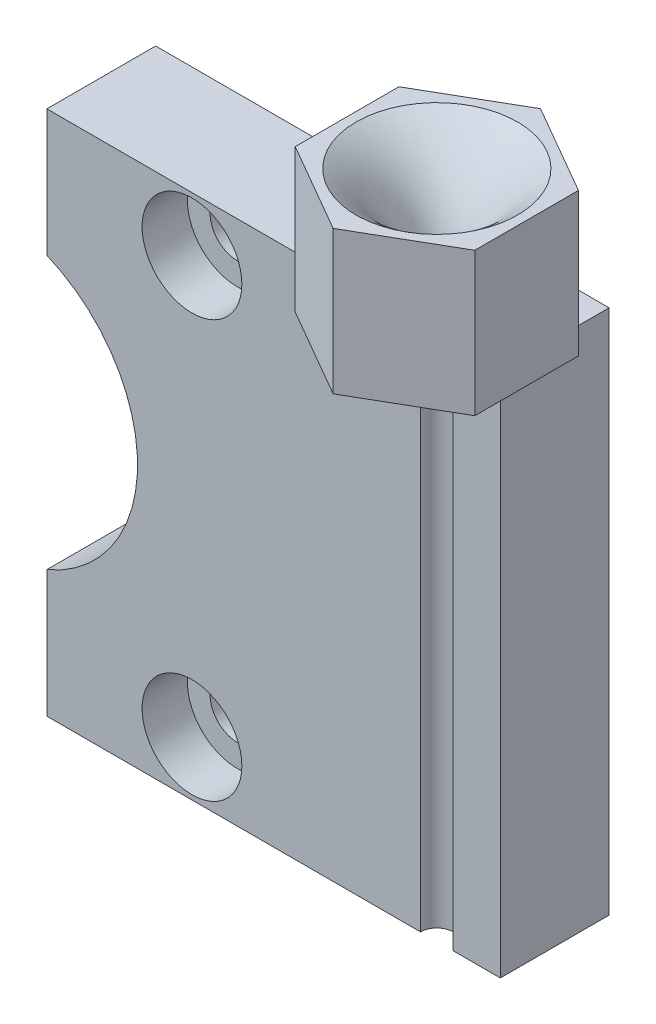
ISO-10303-21;
HEADER;
FILE_DESCRIPTION(('STEP AP214'),'2;1');
FILE_NAME('part.step','',(''),(''),'','','');
FILE_SCHEMA(('AUTOMOTIVE_DESIGN { 1 0 10303 214 1 1 1 1 }'));
ENDSEC;
DATA;
#1=APPLICATION_CONTEXT('core data for automotive mechanical design processes');
#2=APPLICATION_PROTOCOL_DEFINITION('international standard','automotive_design',2000,#1);
#3=PRODUCT_CONTEXT('',#1,'mechanical');
#4=PRODUCT('Part','Part','',(#3));
#5=PRODUCT_RELATED_PRODUCT_CATEGORY('part','',(#4));
#6=PRODUCT_DEFINITION_FORMATION('','',#4);
#7=PRODUCT_DEFINITION_CONTEXT('part definition',#1,'design');
#8=PRODUCT_DEFINITION('design','',#6,#7);
#9=PRODUCT_DEFINITION_SHAPE('','',#8);
#10=(LENGTH_UNIT() NAMED_UNIT(*) SI_UNIT(.MILLI.,.METRE.));
#11=(NAMED_UNIT(*) PLANE_ANGLE_UNIT() SI_UNIT($,.RADIAN.));
#12=(NAMED_UNIT(*) SI_UNIT($,.STERADIAN.) SOLID_ANGLE_UNIT());
#13=UNCERTAINTY_MEASURE_WITH_UNIT(LENGTH_MEASURE(1.E-05),#10,'distance_accuracy_value','');
#14=(GEOMETRIC_REPRESENTATION_CONTEXT(3) GLOBAL_UNCERTAINTY_ASSIGNED_CONTEXT((#13)) GLOBAL_UNIT_ASSIGNED_CONTEXT((#10,
#11,#12)) REPRESENTATION_CONTEXT('',''));
#15=CARTESIAN_POINT('',(0.,0.,0.));
#16=DIRECTION('',(0.,0.,1.));
#17=DIRECTION('',(1.,0.,0.));
#18=AXIS2_PLACEMENT_3D('',#15,#16,#17);
#19=CARTESIAN_POINT('',(-11.125,0.,0.));
#20=DIRECTION('',(0.,0.,-1.));
#21=DIRECTION('',(-1.,0.,0.));
#22=AXIS2_PLACEMENT_3D('',#19,#20,#21);
#23=PLANE('',#22);
#24=CARTESIAN_POINT('',(0.,11.5,0.));
#25=DIRECTION('',(0.,0.,-1.));
#26=DIRECTION('',(-1.,0.,0.));
#27=AXIS2_PLACEMENT_3D('',#24,#25,#26);
#28=CIRCLE('',#27,2.);
#29=CARTESIAN_POINT('',(-2.,11.5,0.));
#30=VERTEX_POINT('',#29);
#31=EDGE_CURVE('E609',#30,#30,#28,.T.);
#32=ORIENTED_EDGE('',*,*,#31,.F.);
#33=EDGE_LOOP('',(#32));
#34=FACE_BOUND('',#33,.T.);
#35=DIRECTION('',(0.,-1.,0.));
#36=VECTOR('',#35,1.);
#37=CARTESIAN_POINT('',(-8.,14.5,0.));
#38=LINE('',#37,#36);
#39=CARTESIAN_POINT('',(-8.,14.5,0.));
#40=VERTEX_POINT('',#39);
#41=CARTESIAN_POINT('',(-7.99999999999999,7.5,0.));
#42=VERTEX_POINT('',#41);
#43=EDGE_CURVE('E176',#40,#42,#38,.T.);
#44=ORIENTED_EDGE('',*,*,#43,.F.);
#45=DIRECTION('',(-1.,0.,0.));
#46=VECTOR('',#45,1.);
#47=CARTESIAN_POINT('',(17.,14.5,0.));
#48=LINE('',#47,#46);
#49=CARTESIAN_POINT('',(17.,14.5,0.));
#50=VERTEX_POINT('',#49);
#51=EDGE_CURVE('E181',#50,#40,#48,.T.);
#52=ORIENTED_EDGE('',*,*,#51,.F.);
#53=DIRECTION('',(0.,1.,0.));
#54=VECTOR('',#53,1.);
#55=CARTESIAN_POINT('',(17.,-14.5,0.));
#56=LINE('',#55,#54);
#57=CARTESIAN_POINT('',(17.,-14.5,0.));
#58=VERTEX_POINT('',#57);
#59=EDGE_CURVE('E205',#58,#50,#56,.T.);
#60=ORIENTED_EDGE('',*,*,#59,.F.);
#61=DIRECTION('',(1.,0.,0.));
#62=VECTOR('',#61,1.);
#63=CARTESIAN_POINT('',(-8.,-14.5,0.));
#64=LINE('',#63,#62);
#65=CARTESIAN_POINT('',(-8.,-14.5,0.));
#66=VERTEX_POINT('',#65);
#67=EDGE_CURVE('E203',#66,#58,#64,.T.);
#68=ORIENTED_EDGE('',*,*,#67,.F.);
#69=DIRECTION('',(0.,-1.,0.));
#70=VECTOR('',#69,1.);
#71=CARTESIAN_POINT('',(-7.99999999999999,-7.5,0.));
#72=LINE('',#71,#70);
#73=CARTESIAN_POINT('',(-7.99999999999999,-7.5,0.));
#74=VERTEX_POINT('',#73);
#75=EDGE_CURVE('E201',#74,#66,#72,.T.);
#76=ORIENTED_EDGE('',*,*,#75,.F.);
#77=CARTESIAN_POINT('',(-11.125,0.,0.));
#78=DIRECTION('',(0.,0.,-1.));
#79=DIRECTION('',(-1.,0.,0.));
#80=AXIS2_PLACEMENT_3D('',#77,#78,#79);
#81=CIRCLE('',#80,8.125);
#82=EDGE_CURVE('E199',#42,#74,#81,.T.);
#83=ORIENTED_EDGE('',*,*,#82,.F.);
#84=EDGE_LOOP('',(#44,#52,#60,#68,#76,#83));
#85=FACE_BOUND('',#84,.T.);
#86=CARTESIAN_POINT('',(0.,-11.5,0.));
#87=DIRECTION('',(0.,0.,-1.));
#88=DIRECTION('',(-1.,0.,0.));
#89=AXIS2_PLACEMENT_3D('',#86,#87,#88);
#90=CIRCLE('',#89,2.);
#91=CARTESIAN_POINT('',(-2.,-11.5,0.));
#92=VERTEX_POINT('',#91);
#93=EDGE_CURVE('E599',#92,#92,#90,.T.);
#94=ORIENTED_EDGE('',*,*,#93,.F.);
#95=EDGE_LOOP('',(#94));
#96=FACE_BOUND('',#95,.T.);
#97=ADVANCED_FACE('F33',(#34,#85,#96),#23,.T.);
#98=CARTESIAN_POINT('',(-11.125,0.,6.));
#99=DIRECTION('',(0.,0.,-1.));
#100=DIRECTION('',(-1.,0.,0.));
#101=AXIS2_PLACEMENT_3D('',#98,#99,#100);
#102=PLANE('',#101);
#103=DIRECTION('',(1.,0.,0.));
#104=VECTOR('',#103,1.);
#105=CARTESIAN_POINT('',(-8.,-14.5,6.));
#106=LINE('',#105,#104);
#107=CARTESIAN_POINT('',(-8.,-14.5,6.));
#108=VERTEX_POINT('',#107);
#109=CARTESIAN_POINT('',(12.6,-14.5,6.));
#110=VERTEX_POINT('',#109);
#111=EDGE_CURVE('E186',#108,#110,#106,.T.);
#112=ORIENTED_EDGE('',*,*,#111,.T.);
#113=DIRECTION('',(0.,1.,0.));
#114=VECTOR('',#113,1.);
#115=CARTESIAN_POINT('',(12.6,-14.5,6.));
#116=LINE('',#115,#114);
#117=CARTESIAN_POINT('',(12.6,14.5,6.));
#118=VERTEX_POINT('',#117);
#119=EDGE_CURVE('E174',#110,#118,#116,.T.);
#120=ORIENTED_EDGE('',*,*,#119,.T.);
#121=DIRECTION('',(-1.,0.,0.));
#122=VECTOR('',#121,1.);
#123=CARTESIAN_POINT('',(17.,14.5,6.));
#124=LINE('',#123,#122);
#125=CARTESIAN_POINT('',(8.55,14.5,6.));
#126=VERTEX_POINT('',#125);
#127=EDGE_CURVE('E196',#118,#126,#124,.T.);
#128=ORIENTED_EDGE('',*,*,#127,.T.);
#129=CARTESIAN_POINT('',(-8.,14.5,6.));
#130=VERTEX_POINT('',#129);
#131=EDGE_CURVE('E191',#126,#130,#124,.T.);
#132=ORIENTED_EDGE('',*,*,#131,.T.);
#133=DIRECTION('',(0.,-1.,0.));
#134=VECTOR('',#133,1.);
#135=CARTESIAN_POINT('',(-8.,14.5,6.));
#136=LINE('',#135,#134);
#137=CARTESIAN_POINT('',(-7.99999999999999,7.5,6.));
#138=VERTEX_POINT('',#137);
#139=EDGE_CURVE('E177',#130,#138,#136,.T.);
#140=ORIENTED_EDGE('',*,*,#139,.T.);
#141=CARTESIAN_POINT('',(-11.125,0.,6.));
#142=DIRECTION('',(0.,0.,-1.));
#143=DIRECTION('',(-1.,0.,0.));
#144=AXIS2_PLACEMENT_3D('',#141,#142,#143);
#145=CIRCLE('',#144,8.125);
#146=CARTESIAN_POINT('',(-7.99999999999999,-7.5,6.));
#147=VERTEX_POINT('',#146);
#148=EDGE_CURVE('E180',#138,#147,#145,.T.);
#149=ORIENTED_EDGE('',*,*,#148,.T.);
#150=DIRECTION('',(0.,-1.,0.));
#151=VECTOR('',#150,1.);
#152=CARTESIAN_POINT('',(-7.99999999999999,-7.5,6.));
#153=LINE('',#152,#151);
#154=EDGE_CURVE('E183',#147,#108,#153,.T.);
#155=ORIENTED_EDGE('',*,*,#154,.T.);
#156=EDGE_LOOP('',(#112,#120,#128,#132,#140,#149,#155));
#157=FACE_BOUND('',#156,.T.);
#158=CARTESIAN_POINT('',(0.,11.5,6.));
#159=DIRECTION('',(0.,0.,1.));
#160=DIRECTION('',(1.,0.,0.));
#161=AXIS2_PLACEMENT_3D('',#158,#159,#160);
#162=CIRCLE('',#161,2.75);
#163=CARTESIAN_POINT('',(2.75,11.5,6.));
#164=VERTEX_POINT('',#163);
#165=EDGE_CURVE('E235',#164,#164,#162,.T.);
#166=ORIENTED_EDGE('',*,*,#165,.F.);
#167=EDGE_LOOP('',(#166));
#168=FACE_BOUND('',#167,.T.);
#169=CARTESIAN_POINT('',(0.,-11.5,6.));
#170=DIRECTION('',(0.,0.,1.));
#171=DIRECTION('',(1.,0.,0.));
#172=AXIS2_PLACEMENT_3D('',#169,#170,#171);
#173=CIRCLE('',#172,2.75);
#174=CARTESIAN_POINT('',(2.75,-11.5,6.));
#175=VERTEX_POINT('',#174);
#176=EDGE_CURVE('E613',#175,#175,#173,.T.);
#177=ORIENTED_EDGE('',*,*,#176,.F.);
#178=EDGE_LOOP('',(#177));
#179=FACE_BOUND('',#178,.T.);
#180=ADVANCED_FACE('F314',(#157,#168,#179),#102,.F.);
#181=CARTESIAN_POINT('',(13.5,-14.5,6.));
#182=DIRECTION('',(0.,1.,0.));
#183=DIRECTION('',(0.,0.,1.));
#184=AXIS2_PLACEMENT_3D('',#181,#182,#183);
#185=CYLINDRICAL_SURFACE('',#184,0.9);
#186=CARTESIAN_POINT('',(13.5,-14.5,6.));
#187=DIRECTION('',(0.,1.,0.));
#188=DIRECTION('',(0.,0.,1.));
#189=AXIS2_PLACEMENT_3D('',#186,#187,#188);
#190=CIRCLE('',#189,0.9);
#191=CARTESIAN_POINT('',(14.4,-14.5,6.));
#192=VERTEX_POINT('',#191);
#193=EDGE_CURVE('E163',#192,#110,#190,.T.);
#194=ORIENTED_EDGE('',*,*,#193,.F.);
#195=DIRECTION('',(0.,1.,0.));
#196=VECTOR('',#195,1.);
#197=CARTESIAN_POINT('',(14.4,-14.5,6.));
#198=LINE('',#197,#196);
#199=CARTESIAN_POINT('',(14.4,14.5,6.));
#200=VERTEX_POINT('',#199);
#201=EDGE_CURVE('E166',#200,#192,#198,.F.);
#202=ORIENTED_EDGE('',*,*,#201,.F.);
#203=CARTESIAN_POINT('',(13.5,14.5,6.));
#204=DIRECTION('',(0.,1.,0.));
#205=DIRECTION('',(0.,0.,1.));
#206=AXIS2_PLACEMENT_3D('',#203,#204,#205);
#207=CIRCLE('',#206,0.9);
#208=EDGE_CURVE('E245',#118,#200,#207,.T.);
#209=ORIENTED_EDGE('',*,*,#208,.F.);
#210=ORIENTED_EDGE('',*,*,#119,.F.);
#211=EDGE_LOOP('',(#194,#202,#209,#210));
#212=FACE_BOUND('',#211,.T.);
#213=CARTESIAN_POINT('',(13.5,16.4,6.00000000000001));
#214=DIRECTION('',(0.,1.,0.));
#215=DIRECTION('',(-1.,0.,0.));
#216=AXIS2_PLACEMENT_3D('',#213,#214,#215);
#217=CIRCLE('',#216,0.899999999999998);
#218=CARTESIAN_POINT('',(12.6,16.4,6.00000000000001));
#219=VERTEX_POINT('',#218);
#220=EDGE_CURVE('E227',#219,#219,#217,.T.);
#221=ORIENTED_EDGE('',*,*,#220,.T.);
#222=EDGE_LOOP('',(#221));
#223=FACE_BOUND('',#222,.T.);
#224=ADVANCED_FACE('F334',(#212,#223),#185,.F.);
#225=CARTESIAN_POINT('',(0.,22.4,0.));
#226=DIRECTION('',(0.,1.,0.));
#227=DIRECTION('',(0.,0.,1.));
#228=AXIS2_PLACEMENT_3D('',#225,#226,#227);
#229=PLANE('',#228);
#230=DIRECTION('',(-0.866025403784439,0.,-0.5));
#231=VECTOR('',#230,1.);
#232=CARTESIAN_POINT('',(18.45,22.4,3.14211616751135));
#233=LINE('',#232,#231);
#234=CARTESIAN_POINT('',(18.45,22.4,3.14211616751135));
#235=VERTEX_POINT('',#234);
#236=CARTESIAN_POINT('',(13.5,22.4,0.284232335022699));
#237=VERTEX_POINT('',#236);
#238=EDGE_CURVE('E149',#235,#237,#233,.T.);
#239=ORIENTED_EDGE('',*,*,#238,.T.);
#240=DIRECTION('',(-0.866025403784439,0.,0.5));
#241=VECTOR('',#240,1.);
#242=CARTESIAN_POINT('',(13.5,22.4,0.284232335022699));
#243=LINE('',#242,#241);
#244=CARTESIAN_POINT('',(8.55,22.4,3.14211616751135));
#245=VERTEX_POINT('',#244);
#246=EDGE_CURVE('E139',#237,#245,#243,.T.);
#247=ORIENTED_EDGE('',*,*,#246,.T.);
#248=DIRECTION('',(0.,0.,1.));
#249=VECTOR('',#248,1.);
#250=CARTESIAN_POINT('',(8.55,22.4,3.14211616751135));
#251=LINE('',#250,#249);
#252=CARTESIAN_POINT('',(8.55,22.4,8.85788383248865));
#253=VERTEX_POINT('',#252);
#254=EDGE_CURVE('E148',#245,#253,#251,.T.);
#255=ORIENTED_EDGE('',*,*,#254,.T.);
#256=DIRECTION('',(0.866025403784439,0.,0.5));
#257=VECTOR('',#256,1.);
#258=CARTESIAN_POINT('',(8.55,22.4,8.85788383248865));
#259=LINE('',#258,#257);
#260=CARTESIAN_POINT('',(13.5,22.4,11.7157676649773));
#261=VERTEX_POINT('',#260);
#262=EDGE_CURVE('E249',#253,#261,#259,.T.);
#263=ORIENTED_EDGE('',*,*,#262,.T.);
#264=DIRECTION('',(0.866025403784439,0.,-0.5));
#265=VECTOR('',#264,1.);
#266=CARTESIAN_POINT('',(13.5,22.4,11.7157676649773));
#267=LINE('',#266,#265);
#268=CARTESIAN_POINT('',(18.45,22.4,8.85788383248865));
#269=VERTEX_POINT('',#268);
#270=EDGE_CURVE('E251',#261,#269,#267,.T.);
#271=ORIENTED_EDGE('',*,*,#270,.T.);
#272=DIRECTION('',(0.,0.,-1.));
#273=VECTOR('',#272,1.);
#274=CARTESIAN_POINT('',(18.45,22.4,8.85788383248865));
#275=LINE('',#274,#273);
#276=EDGE_CURVE('E155',#269,#235,#275,.T.);
#277=ORIENTED_EDGE('',*,*,#276,.T.);
#278=EDGE_LOOP('',(#239,#247,#255,#263,#271,#277));
#279=FACE_BOUND('',#278,.T.);
#280=CARTESIAN_POINT('',(13.5,22.4,6.00000000000001));
#281=DIRECTION('',(0.,1.,0.));
#282=DIRECTION('',(-1.,0.,0.));
#283=AXIS2_PLACEMENT_3D('',#280,#281,#282);
#284=CIRCLE('',#283,4.45);
#285=CARTESIAN_POINT('',(9.05000000000001,22.4,6.00000000000001));
#286=VERTEX_POINT('',#285);
#287=EDGE_CURVE('E232',#286,#286,#284,.T.);
#288=ORIENTED_EDGE('',*,*,#287,.F.);
#289=EDGE_LOOP('',(#288));
#290=FACE_BOUND('',#289,.T.);
#291=ADVANCED_FACE('F152',(#279,#290),#229,.T.);
#292=CARTESIAN_POINT('',(17.,14.5,6.));
#293=DIRECTION('',(0.,-1.,0.));
#294=DIRECTION('',(0.,0.,-1.));
#295=AXIS2_PLACEMENT_3D('',#292,#293,#294);
#296=PLANE('',#295);
#297=DIRECTION('',(-0.866025403784439,0.,-0.5));
#298=VECTOR('',#297,1.);
#299=CARTESIAN_POINT('',(18.45,14.5,3.14211616751135));
#300=LINE('',#299,#298);
#301=CARTESIAN_POINT('',(17.,14.5,2.30495827718639));
#302=VERTEX_POINT('',#301);
#303=CARTESIAN_POINT('',(13.5,14.5,0.284232335022699));
#304=VERTEX_POINT('',#303);
#305=EDGE_CURVE('E11',#302,#304,#300,.T.);
#306=ORIENTED_EDGE('',*,*,#305,.F.);
#307=DIRECTION('',(0.,0.,-1.));
#308=VECTOR('',#307,1.);
#309=CARTESIAN_POINT('',(17.,14.5,6.));
#310=LINE('',#309,#308);
#311=EDGE_CURVE('E211',#302,#50,#310,.T.);
#312=ORIENTED_EDGE('',*,*,#311,.T.);
#313=ORIENTED_EDGE('',*,*,#51,.T.);
#314=DIRECTION('',(0.,0.,-1.));
#315=VECTOR('',#314,1.);
#316=CARTESIAN_POINT('',(-8.,14.5,6.));
#317=LINE('',#316,#315);
#318=EDGE_CURVE('E195',#130,#40,#317,.T.);
#319=ORIENTED_EDGE('',*,*,#318,.F.);
#320=ORIENTED_EDGE('',*,*,#131,.F.);
#321=DIRECTION('',(0.,0.,1.));
#322=VECTOR('',#321,1.);
#323=CARTESIAN_POINT('',(8.55,14.5,3.14211616751135));
#324=LINE('',#323,#322);
#325=CARTESIAN_POINT('',(8.55,14.5,3.14211616751135));
#326=VERTEX_POINT('',#325);
#327=EDGE_CURVE('E257',#326,#126,#324,.T.);
#328=ORIENTED_EDGE('',*,*,#327,.F.);
#329=DIRECTION('',(-0.866025403784439,0.,0.5));
#330=VECTOR('',#329,1.);
#331=CARTESIAN_POINT('',(13.5,14.5,0.284232335022699));
#332=LINE('',#331,#330);
#333=EDGE_CURVE('E51',#304,#326,#332,.T.);
#334=ORIENTED_EDGE('',*,*,#333,.F.);
#335=EDGE_LOOP('',(#306,#312,#313,#319,#320,#328,#334));
#336=FACE_BOUND('',#335,.T.);
#337=ADVANCED_FACE('F299',(#336),#296,.F.);
#338=CARTESIAN_POINT('',(17.,14.5,6.));
#339=VERTEX_POINT('',#338);
#340=EDGE_CURVE('E192',#339,#200,#124,.T.);
#341=ORIENTED_EDGE('',*,*,#340,.T.);
#342=ORIENTED_EDGE('',*,*,#201,.T.);
#343=CARTESIAN_POINT('',(17.,-14.5,6.));
#344=VERTEX_POINT('',#343);
#345=EDGE_CURVE('E185',#192,#344,#106,.T.);
#346=ORIENTED_EDGE('',*,*,#345,.T.);
#347=DIRECTION('',(0.,1.,0.));
#348=VECTOR('',#347,1.);
#349=CARTESIAN_POINT('',(17.,-14.5,6.));
#350=LINE('',#349,#348);
#351=EDGE_CURVE('E189',#344,#339,#350,.T.);
#352=ORIENTED_EDGE('',*,*,#351,.T.);
#353=EDGE_LOOP('',(#341,#342,#346,#352));
#354=FACE_BOUND('',#353,.T.);
#355=ADVANCED_FACE('F336',(#354),#102,.F.);
#356=CARTESIAN_POINT('',(-8.,14.5,6.));
#357=DIRECTION('',(1.,0.,0.));
#358=DIRECTION('',(0.,1.,0.));
#359=AXIS2_PLACEMENT_3D('',#356,#357,#358);
#360=PLANE('',#359);
#361=ORIENTED_EDGE('',*,*,#43,.T.);
#362=DIRECTION('',(0.,0.,-1.));
#363=VECTOR('',#362,1.);
#364=CARTESIAN_POINT('',(-7.99999999999999,7.5,6.));
#365=LINE('',#364,#363);
#366=EDGE_CURVE('E42',#138,#42,#365,.T.);
#367=ORIENTED_EDGE('',*,*,#366,.F.);
#368=ORIENTED_EDGE('',*,*,#139,.F.);
#369=ORIENTED_EDGE('',*,*,#318,.T.);
#370=EDGE_LOOP('',(#361,#367,#368,#369));
#371=FACE_BOUND('',#370,.T.);
#372=ADVANCED_FACE('F35',(#371),#360,.F.);
#373=CARTESIAN_POINT('',(-11.125,0.,6.));
#374=DIRECTION('',(0.,0.,-1.));
#375=DIRECTION('',(-1.,0.,0.));
#376=AXIS2_PLACEMENT_3D('',#373,#374,#375);
#377=CYLINDRICAL_SURFACE('',#376,8.125);
#378=ORIENTED_EDGE('',*,*,#82,.T.);
#379=DIRECTION('',(0.,0.,-1.));
#380=VECTOR('',#379,1.);
#381=CARTESIAN_POINT('',(-7.99999999999999,-7.5,6.));
#382=LINE('',#381,#380);
#383=EDGE_CURVE('E221',#147,#74,#382,.T.);
#384=ORIENTED_EDGE('',*,*,#383,.F.);
#385=ORIENTED_EDGE('',*,*,#148,.F.);
#386=ORIENTED_EDGE('',*,*,#366,.T.);
#387=EDGE_LOOP('',(#378,#384,#385,#386));
#388=FACE_BOUND('',#387,.T.);
#389=ADVANCED_FACE('F311',(#388),#377,.F.);
#390=CARTESIAN_POINT('',(-7.99999999999999,-7.5,6.));
#391=DIRECTION('',(1.,0.,0.));
#392=DIRECTION('',(0.,1.,0.));
#393=AXIS2_PLACEMENT_3D('',#390,#391,#392);
#394=PLANE('',#393);
#395=ORIENTED_EDGE('',*,*,#75,.T.);
#396=DIRECTION('',(0.,0.,-1.));
#397=VECTOR('',#396,1.);
#398=CARTESIAN_POINT('',(-8.,-14.5,6.));
#399=LINE('',#398,#397);
#400=EDGE_CURVE('E218',#108,#66,#399,.T.);
#401=ORIENTED_EDGE('',*,*,#400,.F.);
#402=ORIENTED_EDGE('',*,*,#154,.F.);
#403=ORIENTED_EDGE('',*,*,#383,.T.);
#404=EDGE_LOOP('',(#395,#401,#402,#403));
#405=FACE_BOUND('',#404,.T.);
#406=ADVANCED_FACE('F348',(#405),#394,.F.);
#407=CARTESIAN_POINT('',(-8.,-14.5,6.));
#408=DIRECTION('',(0.,1.,0.));
#409=DIRECTION('',(-1.,0.,0.));
#410=AXIS2_PLACEMENT_3D('',#407,#408,#409);
#411=PLANE('',#410);
#412=ORIENTED_EDGE('',*,*,#345,.F.);
#413=ORIENTED_EDGE('',*,*,#193,.T.);
#414=ORIENTED_EDGE('',*,*,#111,.F.);
#415=ORIENTED_EDGE('',*,*,#400,.T.);
#416=ORIENTED_EDGE('',*,*,#67,.T.);
#417=DIRECTION('',(0.,0.,-1.));
#418=VECTOR('',#417,1.);
#419=CARTESIAN_POINT('',(17.,-14.5,6.));
#420=LINE('',#419,#418);
#421=EDGE_CURVE('E215',#344,#58,#420,.T.);
#422=ORIENTED_EDGE('',*,*,#421,.F.);
#423=EDGE_LOOP('',(#412,#413,#414,#415,#416,#422));
#424=FACE_BOUND('',#423,.T.);
#425=ADVANCED_FACE('F345',(#424),#411,.F.);
#426=CARTESIAN_POINT('',(17.,-14.5,6.));
#427=DIRECTION('',(-1.,0.,0.));
#428=DIRECTION('',(0.,-1.,0.));
#429=AXIS2_PLACEMENT_3D('',#426,#427,#428);
#430=PLANE('',#429);
#431=ORIENTED_EDGE('',*,*,#59,.T.);
#432=ORIENTED_EDGE('',*,*,#311,.F.);
#433=EDGE_CURVE('E212',#339,#302,#310,.T.);
#434=ORIENTED_EDGE('',*,*,#433,.F.);
#435=ORIENTED_EDGE('',*,*,#351,.F.);
#436=ORIENTED_EDGE('',*,*,#421,.T.);
#437=EDGE_LOOP('',(#431,#432,#434,#435,#436));
#438=FACE_BOUND('',#437,.T.);
#439=ADVANCED_FACE('F296',(#438),#430,.F.);
#440=CARTESIAN_POINT('',(0.,11.5,6.));
#441=DIRECTION('',(0.,0.,-1.));
#442=DIRECTION('',(-1.,0.,0.));
#443=AXIS2_PLACEMENT_3D('',#440,#441,#442);
#444=CYLINDRICAL_SURFACE('',#443,1.5);
#445=CARTESIAN_POINT('',(0.,11.5,3.5));
#446=DIRECTION('',(0.,0.,-1.));
#447=DIRECTION('',(-1.,0.,0.));
#448=AXIS2_PLACEMENT_3D('',#445,#446,#447);
#449=CIRCLE('',#448,1.5);
#450=CARTESIAN_POINT('',(-1.5,11.5,3.5));
#451=VERTEX_POINT('',#450);
#452=EDGE_CURVE('E225',#451,#451,#449,.T.);
#453=ORIENTED_EDGE('',*,*,#452,.F.);
#454=EDGE_LOOP('',(#453));
#455=FACE_BOUND('',#454,.T.);
#456=CARTESIAN_POINT('',(0.,11.5,-1.));
#457=DIRECTION('',(0.,0.,-1.));
#458=DIRECTION('',(-1.,0.,0.));
#459=AXIS2_PLACEMENT_3D('',#456,#457,#458);
#460=CIRCLE('',#459,1.5);
#461=CARTESIAN_POINT('',(-1.5,11.5,-1.));
#462=VERTEX_POINT('',#461);
#463=EDGE_CURVE('E602',#462,#462,#460,.T.);
#464=ORIENTED_EDGE('',*,*,#463,.T.);
#465=EDGE_LOOP('',(#464));
#466=FACE_BOUND('',#465,.T.);
#467=ADVANCED_FACE('F344',(#455,#466),#444,.F.);
#468=CARTESIAN_POINT('',(0.,-11.5,6.));
#469=DIRECTION('',(0.,0.,-1.));
#470=DIRECTION('',(-1.,0.,0.));
#471=AXIS2_PLACEMENT_3D('',#468,#469,#470);
#472=CYLINDRICAL_SURFACE('',#471,1.5);
#473=CARTESIAN_POINT('',(0.,-11.5,3.5));
#474=DIRECTION('',(0.,0.,-1.));
#475=DIRECTION('',(-1.,0.,0.));
#476=AXIS2_PLACEMENT_3D('',#473,#474,#475);
#477=CIRCLE('',#476,1.5);
#478=CARTESIAN_POINT('',(-1.5,-11.5,3.5));
#479=VERTEX_POINT('',#478);
#480=EDGE_CURVE('E37',#479,#479,#477,.T.);
#481=ORIENTED_EDGE('',*,*,#480,.F.);
#482=EDGE_LOOP('',(#481));
#483=FACE_BOUND('',#482,.T.);
#484=CARTESIAN_POINT('',(0.,-11.5,-1.));
#485=DIRECTION('',(0.,0.,-1.));
#486=DIRECTION('',(-1.,0.,0.));
#487=AXIS2_PLACEMENT_3D('',#484,#485,#486);
#488=CIRCLE('',#487,1.5);
#489=CARTESIAN_POINT('',(-1.5,-11.5,-1.));
#490=VERTEX_POINT('',#489);
#491=EDGE_CURVE('E600',#490,#490,#488,.T.);
#492=ORIENTED_EDGE('',*,*,#491,.T.);
#493=EDGE_LOOP('',(#492));
#494=FACE_BOUND('',#493,.T.);
#495=ADVANCED_FACE('F390',(#483,#494),#472,.F.);
#496=CARTESIAN_POINT('',(0.,14.5,0.));
#497=DIRECTION('',(0.,1.,0.));
#498=DIRECTION('',(0.,0.,1.));
#499=AXIS2_PLACEMENT_3D('',#496,#497,#498);
#500=PLANE('',#499);
#501=ORIENTED_EDGE('',*,*,#127,.F.);
#502=ORIENTED_EDGE('',*,*,#208,.T.);
#503=ORIENTED_EDGE('',*,*,#340,.F.);
#504=ORIENTED_EDGE('',*,*,#433,.T.);
#505=CARTESIAN_POINT('',(18.45,14.5,3.14211616751135));
#506=VERTEX_POINT('',#505);
#507=EDGE_CURVE('E44',#506,#302,#300,.T.);
#508=ORIENTED_EDGE('',*,*,#507,.F.);
#509=DIRECTION('',(0.,0.,-1.));
#510=VECTOR('',#509,1.);
#511=CARTESIAN_POINT('',(18.45,14.5,8.85788383248865));
#512=LINE('',#511,#510);
#513=CARTESIAN_POINT('',(18.45,14.5,8.85788383248865));
#514=VERTEX_POINT('',#513);
#515=EDGE_CURVE('E159',#514,#506,#512,.T.);
#516=ORIENTED_EDGE('',*,*,#515,.F.);
#517=DIRECTION('',(0.866025403784439,0.,-0.5));
#518=VECTOR('',#517,1.);
#519=CARTESIAN_POINT('',(13.5,14.5,11.7157676649773));
#520=LINE('',#519,#518);
#521=CARTESIAN_POINT('',(13.5,14.5,11.7157676649773));
#522=VERTEX_POINT('',#521);
#523=EDGE_CURVE('E262',#522,#514,#520,.T.);
#524=ORIENTED_EDGE('',*,*,#523,.F.);
#525=DIRECTION('',(0.866025403784439,0.,0.5));
#526=VECTOR('',#525,1.);
#527=CARTESIAN_POINT('',(8.55,14.5,8.85788383248865));
#528=LINE('',#527,#526);
#529=CARTESIAN_POINT('',(8.55,14.5,8.85788383248865));
#530=VERTEX_POINT('',#529);
#531=EDGE_CURVE('E260',#530,#522,#528,.T.);
#532=ORIENTED_EDGE('',*,*,#531,.F.);
#533=EDGE_CURVE('E256',#126,#530,#324,.T.);
#534=ORIENTED_EDGE('',*,*,#533,.F.);
#535=EDGE_LOOP('',(#501,#502,#503,#504,#508,#516,#524,#532,#534));
#536=FACE_BOUND('',#535,.T.);
#537=ADVANCED_FACE('F283',(#536),#500,.F.);
#538=CARTESIAN_POINT('',(18.45,22.4,3.14211616751135));
#539=DIRECTION('',(-0.5,0.,0.866025403784439));
#540=DIRECTION('',(0.866025403784439,0.,0.5));
#541=AXIS2_PLACEMENT_3D('',#538,#539,#540);
#542=PLANE('',#541);
#543=ORIENTED_EDGE('',*,*,#507,.T.);
#544=ORIENTED_EDGE('',*,*,#305,.T.);
#545=DIRECTION('',(0.,-1.,0.));
#546=VECTOR('',#545,1.);
#547=CARTESIAN_POINT('',(13.5,22.4,0.284232335022699));
#548=LINE('',#547,#546);
#549=EDGE_CURVE('E143',#237,#304,#548,.T.);
#550=ORIENTED_EDGE('',*,*,#549,.F.);
#551=ORIENTED_EDGE('',*,*,#238,.F.);
#552=DIRECTION('',(0.,-1.,0.));
#553=VECTOR('',#552,1.);
#554=CARTESIAN_POINT('',(18.45,22.4,3.14211616751135));
#555=LINE('',#554,#553);
#556=EDGE_CURVE('E253',#235,#506,#555,.T.);
#557=ORIENTED_EDGE('',*,*,#556,.T.);
#558=EDGE_LOOP('',(#543,#544,#550,#551,#557));
#559=FACE_BOUND('',#558,.T.);
#560=ADVANCED_FACE('F162',(#559),#542,.F.);
#561=CARTESIAN_POINT('',(13.5,22.4,0.284232335022699));
#562=DIRECTION('',(0.5,0.,0.866025403784439));
#563=DIRECTION('',(0.866025403784439,0.,-0.5));
#564=AXIS2_PLACEMENT_3D('',#561,#562,#563);
#565=PLANE('',#564);
#566=ORIENTED_EDGE('',*,*,#333,.T.);
#567=DIRECTION('',(0.,-1.,0.));
#568=VECTOR('',#567,1.);
#569=CARTESIAN_POINT('',(8.55,22.4,3.14211616751135));
#570=LINE('',#569,#568);
#571=EDGE_CURVE('E145',#245,#326,#570,.T.);
#572=ORIENTED_EDGE('',*,*,#571,.F.);
#573=ORIENTED_EDGE('',*,*,#246,.F.);
#574=ORIENTED_EDGE('',*,*,#549,.T.);
#575=EDGE_LOOP('',(#566,#572,#573,#574));
#576=FACE_BOUND('',#575,.T.);
#577=ADVANCED_FACE('F141',(#576),#565,.F.);
#578=CARTESIAN_POINT('',(8.55,22.4,3.14211616751135));
#579=DIRECTION('',(1.,0.,0.));
#580=DIRECTION('',(0.,0.,-1.));
#581=AXIS2_PLACEMENT_3D('',#578,#579,#580);
#582=PLANE('',#581);
#583=ORIENTED_EDGE('',*,*,#327,.T.);
#584=ORIENTED_EDGE('',*,*,#533,.T.);
#585=DIRECTION('',(0.,-1.,0.));
#586=VECTOR('',#585,1.);
#587=CARTESIAN_POINT('',(8.55,22.4,8.85788383248865));
#588=LINE('',#587,#586);
#589=EDGE_CURVE('E168',#253,#530,#588,.T.);
#590=ORIENTED_EDGE('',*,*,#589,.F.);
#591=ORIENTED_EDGE('',*,*,#254,.F.);
#592=ORIENTED_EDGE('',*,*,#571,.T.);
#593=EDGE_LOOP('',(#583,#584,#590,#591,#592));
#594=FACE_BOUND('',#593,.T.);
#595=ADVANCED_FACE('F317',(#594),#582,.F.);
#596=CARTESIAN_POINT('',(8.55,22.4,8.85788383248865));
#597=DIRECTION('',(0.5,0.,-0.866025403784439));
#598=DIRECTION('',(-0.866025403784439,0.,-0.5));
#599=AXIS2_PLACEMENT_3D('',#596,#597,#598);
#600=PLANE('',#599);
#601=ORIENTED_EDGE('',*,*,#531,.T.);
#602=DIRECTION('',(0.,-1.,0.));
#603=VECTOR('',#602,1.);
#604=CARTESIAN_POINT('',(13.5,22.4,11.7157676649773));
#605=LINE('',#604,#603);
#606=EDGE_CURVE('E269',#261,#522,#605,.T.);
#607=ORIENTED_EDGE('',*,*,#606,.F.);
#608=ORIENTED_EDGE('',*,*,#262,.F.);
#609=ORIENTED_EDGE('',*,*,#589,.T.);
#610=EDGE_LOOP('',(#601,#607,#608,#609));
#611=FACE_BOUND('',#610,.T.);
#612=ADVANCED_FACE('F276',(#611),#600,.F.);
#613=CARTESIAN_POINT('',(13.5,22.4,11.7157676649773));
#614=DIRECTION('',(-0.5,0.,-0.866025403784439));
#615=DIRECTION('',(-0.866025403784439,0.,0.5));
#616=AXIS2_PLACEMENT_3D('',#613,#614,#615);
#617=PLANE('',#616);
#618=ORIENTED_EDGE('',*,*,#523,.T.);
#619=DIRECTION('',(0.,-1.,0.));
#620=VECTOR('',#619,1.);
#621=CARTESIAN_POINT('',(18.45,22.4,8.85788383248865));
#622=LINE('',#621,#620);
#623=EDGE_CURVE('E266',#269,#514,#622,.T.);
#624=ORIENTED_EDGE('',*,*,#623,.F.);
#625=ORIENTED_EDGE('',*,*,#270,.F.);
#626=ORIENTED_EDGE('',*,*,#606,.T.);
#627=EDGE_LOOP('',(#618,#624,#625,#626));
#628=FACE_BOUND('',#627,.T.);
#629=ADVANCED_FACE('F288',(#628),#617,.F.);
#630=CARTESIAN_POINT('',(18.45,22.4,8.85788383248865));
#631=DIRECTION('',(-1.,0.,0.));
#632=DIRECTION('',(0.,0.,1.));
#633=AXIS2_PLACEMENT_3D('',#630,#631,#632);
#634=PLANE('',#633);
#635=ORIENTED_EDGE('',*,*,#515,.T.);
#636=ORIENTED_EDGE('',*,*,#556,.F.);
#637=ORIENTED_EDGE('',*,*,#276,.F.);
#638=ORIENTED_EDGE('',*,*,#623,.T.);
#639=EDGE_LOOP('',(#635,#636,#637,#638));
#640=FACE_BOUND('',#639,.T.);
#641=ADVANCED_FACE('F291',(#640),#634,.F.);
#642=CARTESIAN_POINT('',(13.5,15.7333385594252,6.00000000000001));
#643=DIRECTION('',(0.,1.,0.));
#644=DIRECTION('',(-1.,0.,0.));
#645=AXIS2_PLACEMENT_3D('',#642,#643,#644);
#646=TOROIDAL_SURFACE('',#645,8.87217426576029,8.);
#647=ORIENTED_EDGE('',*,*,#287,.T.);
#648=EDGE_LOOP('',(#647));
#649=FACE_BOUND('',#648,.T.);
#650=ORIENTED_EDGE('',*,*,#220,.F.);
#651=EDGE_LOOP('',(#650));
#652=FACE_BOUND('',#651,.T.);
#653=ADVANCED_FACE('F373',(#649,#652),#646,.T.);
#654=CARTESIAN_POINT('',(1.45,11.5,3.5));
#655=DIRECTION('',(0.,0.,-1.));
#656=DIRECTION('',(-1.,0.,0.));
#657=AXIS2_PLACEMENT_3D('',#654,#655,#656);
#658=PLANE('',#657);
#659=ORIENTED_EDGE('',*,*,#452,.T.);
#660=EDGE_LOOP('',(#659));
#661=FACE_BOUND('',#660,.T.);
#662=CARTESIAN_POINT('',(0.,11.5,3.5));
#663=DIRECTION('',(0.,0.,1.));
#664=DIRECTION('',(1.,0.,0.));
#665=AXIS2_PLACEMENT_3D('',#662,#663,#664);
#666=CIRCLE('',#665,2.75);
#667=CARTESIAN_POINT('',(2.75,11.5,3.5));
#668=VERTEX_POINT('',#667);
#669=EDGE_CURVE('E228',#668,#668,#666,.T.);
#670=ORIENTED_EDGE('',*,*,#669,.T.);
#671=EDGE_LOOP('',(#670));
#672=FACE_BOUND('',#671,.T.);
#673=ADVANCED_FACE('F375',(#661,#672),#658,.F.);
#674=CARTESIAN_POINT('',(0.,11.5,6.));
#675=DIRECTION('',(0.,0.,1.));
#676=DIRECTION('',(1.,0.,0.));
#677=AXIS2_PLACEMENT_3D('',#674,#675,#676);
#678=CYLINDRICAL_SURFACE('',#677,2.75);
#679=ORIENTED_EDGE('',*,*,#669,.F.);
#680=EDGE_LOOP('',(#679));
#681=FACE_BOUND('',#680,.T.);
#682=ORIENTED_EDGE('',*,*,#165,.T.);
#683=EDGE_LOOP('',(#682));
#684=FACE_BOUND('',#683,.T.);
#685=ADVANCED_FACE('F382',(#681,#684),#678,.F.);
#686=CARTESIAN_POINT('',(1.45,-11.5,3.5));
#687=DIRECTION('',(0.,0.,-1.));
#688=DIRECTION('',(-1.,0.,0.));
#689=AXIS2_PLACEMENT_3D('',#686,#687,#688);
#690=PLANE('',#689);
#691=ORIENTED_EDGE('',*,*,#480,.T.);
#692=EDGE_LOOP('',(#691));
#693=FACE_BOUND('',#692,.T.);
#694=CARTESIAN_POINT('',(0.,-11.5,3.5));
#695=DIRECTION('',(0.,0.,1.));
#696=DIRECTION('',(1.,0.,0.));
#697=AXIS2_PLACEMENT_3D('',#694,#695,#696);
#698=CIRCLE('',#697,2.75);
#699=CARTESIAN_POINT('',(2.75,-11.5,3.5));
#700=VERTEX_POINT('',#699);
#701=EDGE_CURVE('E617',#700,#700,#698,.T.);
#702=ORIENTED_EDGE('',*,*,#701,.T.);
#703=EDGE_LOOP('',(#702));
#704=FACE_BOUND('',#703,.T.);
#705=ADVANCED_FACE('F439',(#693,#704),#690,.F.);
#706=CARTESIAN_POINT('',(0.,-11.5,6.));
#707=DIRECTION('',(0.,0.,1.));
#708=DIRECTION('',(1.,0.,0.));
#709=AXIS2_PLACEMENT_3D('',#706,#707,#708);
#710=CYLINDRICAL_SURFACE('',#709,2.75);
#711=ORIENTED_EDGE('',*,*,#701,.F.);
#712=EDGE_LOOP('',(#711));
#713=FACE_BOUND('',#712,.T.);
#714=ORIENTED_EDGE('',*,*,#176,.T.);
#715=EDGE_LOOP('',(#714));
#716=FACE_BOUND('',#715,.T.);
#717=ADVANCED_FACE('F447',(#713,#716),#710,.F.);
#718=CARTESIAN_POINT('',(0.,11.5,-1.));
#719=DIRECTION('',(0.,0.,-1.));
#720=DIRECTION('',(-1.,0.,0.));
#721=AXIS2_PLACEMENT_3D('',#718,#719,#720);
#722=PLANE('',#721);
#723=CARTESIAN_POINT('',(0.,11.5,-1.));
#724=DIRECTION('',(0.,0.,-1.));
#725=DIRECTION('',(-1.,0.,0.));
#726=AXIS2_PLACEMENT_3D('',#723,#724,#725);
#727=CIRCLE('',#726,2.);
#728=CARTESIAN_POINT('',(-2.,11.5,-1.));
#729=VERTEX_POINT('',#728);
#730=EDGE_CURVE('E610',#729,#729,#727,.T.);
#731=ORIENTED_EDGE('',*,*,#730,.T.);
#732=EDGE_LOOP('',(#731));
#733=FACE_BOUND('',#732,.T.);
#734=ORIENTED_EDGE('',*,*,#463,.F.);
#735=EDGE_LOOP('',(#734));
#736=FACE_BOUND('',#735,.T.);
#737=ADVANCED_FACE('F456',(#733,#736),#722,.T.);
#738=CARTESIAN_POINT('',(0.,11.5,-1.));
#739=DIRECTION('',(0.,0.,1.));
#740=DIRECTION('',(1.,0.,0.));
#741=AXIS2_PLACEMENT_3D('',#738,#739,#740);
#742=CYLINDRICAL_SURFACE('',#741,2.);
#743=ORIENTED_EDGE('',*,*,#730,.F.);
#744=EDGE_LOOP('',(#743));
#745=FACE_BOUND('',#744,.T.);
#746=ORIENTED_EDGE('',*,*,#31,.T.);
#747=EDGE_LOOP('',(#746));
#748=FACE_BOUND('',#747,.T.);
#749=ADVANCED_FACE('F482',(#745,#748),#742,.T.);
#750=CARTESIAN_POINT('',(0.,-11.5,-1.));
#751=DIRECTION('',(0.,0.,-1.));
#752=DIRECTION('',(-1.,0.,0.));
#753=AXIS2_PLACEMENT_3D('',#750,#751,#752);
#754=PLANE('',#753);
#755=CARTESIAN_POINT('',(0.,-11.5,-1.));
#756=DIRECTION('',(0.,0.,-1.));
#757=DIRECTION('',(-1.,0.,0.));
#758=AXIS2_PLACEMENT_3D('',#755,#756,#757);
#759=CIRCLE('',#758,2.);
#760=CARTESIAN_POINT('',(-2.,-11.5,-1.));
#761=VERTEX_POINT('',#760);
#762=EDGE_CURVE('E596',#761,#761,#759,.T.);
#763=ORIENTED_EDGE('',*,*,#762,.T.);
#764=EDGE_LOOP('',(#763));
#765=FACE_BOUND('',#764,.T.);
#766=ORIENTED_EDGE('',*,*,#491,.F.);
#767=EDGE_LOOP('',(#766));
#768=FACE_BOUND('',#767,.T.);
#769=ADVANCED_FACE('F490',(#765,#768),#754,.T.);
#770=CARTESIAN_POINT('',(0.,-11.5,-1.));
#771=DIRECTION('',(0.,0.,1.));
#772=DIRECTION('',(1.,0.,0.));
#773=AXIS2_PLACEMENT_3D('',#770,#771,#772);
#774=CYLINDRICAL_SURFACE('',#773,2.);
#775=ORIENTED_EDGE('',*,*,#762,.F.);
#776=EDGE_LOOP('',(#775));
#777=FACE_BOUND('',#776,.T.);
#778=ORIENTED_EDGE('',*,*,#93,.T.);
#779=EDGE_LOOP('',(#778));
#780=FACE_BOUND('',#779,.T.);
#781=ADVANCED_FACE('F498',(#777,#780),#774,.T.);
#782=CLOSED_SHELL('',(#97,#180,#224,#291,#337,#355,#372,#389,#406,#425,#439,#467,#495,#537,#560,
#577,#595,#612,#629,#641,#653,#673,#685,#705,#717,#737,#749,#769,#781));
#783=MANIFOLD_SOLID_BREP('B2',#782);
#784=ADVANCED_BREP_SHAPE_REPRESENTATION('',(#18,#783),#14);
#785=SHAPE_DEFINITION_REPRESENTATION(#9,#784);
ENDSEC;
END-ISO-10303-21;
